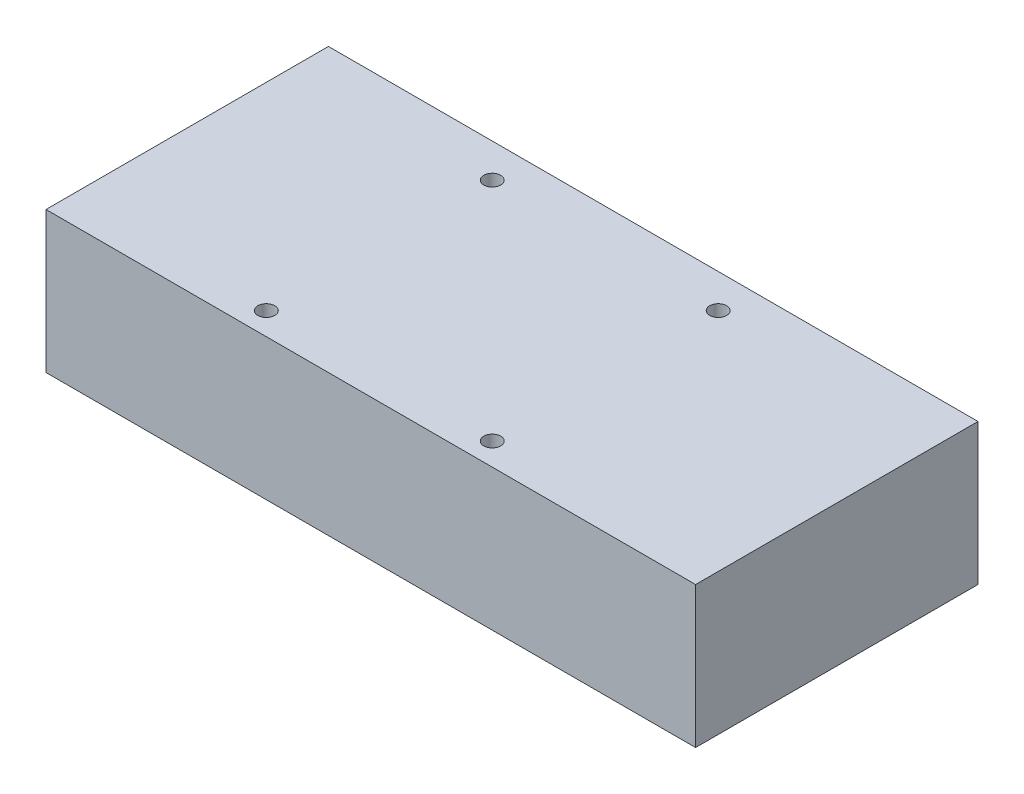
ISO-10303-21;
HEADER;
FILE_DESCRIPTION(('STEP AP214'),'2;1');
FILE_NAME('part.step','',(''),(''),'','','');
FILE_SCHEMA(('AUTOMOTIVE_DESIGN { 1 0 10303 214 1 1 1 1 }'));
ENDSEC;
DATA;
#1=APPLICATION_CONTEXT('core data for automotive mechanical design processes');
#2=APPLICATION_PROTOCOL_DEFINITION('international standard','automotive_design',2000,#1);
#3=PRODUCT_CONTEXT('',#1,'mechanical');
#4=PRODUCT('Part','Part','',(#3));
#5=PRODUCT_RELATED_PRODUCT_CATEGORY('part','',(#4));
#6=PRODUCT_DEFINITION_FORMATION('','',#4);
#7=PRODUCT_DEFINITION_CONTEXT('part definition',#1,'design');
#8=PRODUCT_DEFINITION('design','',#6,#7);
#9=PRODUCT_DEFINITION_SHAPE('','',#8);
#10=(LENGTH_UNIT() NAMED_UNIT(*) SI_UNIT(.MILLI.,.METRE.));
#11=(NAMED_UNIT(*) PLANE_ANGLE_UNIT() SI_UNIT($,.RADIAN.));
#12=(NAMED_UNIT(*) SI_UNIT($,.STERADIAN.) SOLID_ANGLE_UNIT());
#13=UNCERTAINTY_MEASURE_WITH_UNIT(LENGTH_MEASURE(1.E-05),#10,'distance_accuracy_value','');
#14=(GEOMETRIC_REPRESENTATION_CONTEXT(3) GLOBAL_UNCERTAINTY_ASSIGNED_CONTEXT((#13)) GLOBAL_UNIT_ASSIGNED_CONTEXT((#10,
#11,#12)) REPRESENTATION_CONTEXT('',''));
#15=CARTESIAN_POINT('',(0.,0.,0.));
#16=DIRECTION('',(0.,0.,1.));
#17=DIRECTION('',(1.,0.,0.));
#18=AXIS2_PLACEMENT_3D('',#15,#16,#17);
#19=CARTESIAN_POINT('',(0.,25.,0.));
#20=DIRECTION('',(0.,-1.,0.));
#21=DIRECTION('',(0.,0.,-1.));
#22=AXIS2_PLACEMENT_3D('',#19,#20,#21);
#23=PLANE('',#22);
#24=DIRECTION('',(0.,0.,-1.));
#25=VECTOR('',#24,1.);
#26=CARTESIAN_POINT('',(42.6353276353277,25.,-22.9344729344729));
#27=LINE('',#26,#25);
#28=CARTESIAN_POINT('',(42.6353276353277,25.,27.0655270655271));
#29=VERTEX_POINT('',#28);
#30=CARTESIAN_POINT('',(42.6353276353277,25.,-22.9344729344729));
#31=VERTEX_POINT('',#30);
#32=EDGE_CURVE('E96',#29,#31,#27,.T.);
#33=ORIENTED_EDGE('',*,*,#32,.T.);
#34=DIRECTION('',(-1.,0.,0.));
#35=VECTOR('',#34,1.);
#36=CARTESIAN_POINT('',(42.6353276353277,25.,-22.9344729344729));
#37=LINE('',#36,#35);
#38=CARTESIAN_POINT('',(-72.3646723646723,25.,-22.9344729344729));
#39=VERTEX_POINT('',#38);
#40=EDGE_CURVE('E91',#31,#39,#37,.T.);
#41=ORIENTED_EDGE('',*,*,#40,.T.);
#42=DIRECTION('',(0.,0.,1.));
#43=VECTOR('',#42,1.);
#44=CARTESIAN_POINT('',(-72.3646723646723,25.,-22.9344729344729));
#45=LINE('',#44,#43);
#46=CARTESIAN_POINT('',(-72.3646723646723,25.,27.0655270655271));
#47=VERTEX_POINT('',#46);
#48=EDGE_CURVE('E94',#39,#47,#45,.T.);
#49=ORIENTED_EDGE('',*,*,#48,.T.);
#50=DIRECTION('',(1.,0.,0.));
#51=VECTOR('',#50,1.);
#52=CARTESIAN_POINT('',(42.6353276353277,25.,27.0655270655271));
#53=LINE('',#52,#51);
#54=EDGE_CURVE('E61',#47,#29,#53,.T.);
#55=ORIENTED_EDGE('',*,*,#54,.T.);
#56=EDGE_LOOP('',(#33,#41,#49,#55));
#57=FACE_BOUND('',#56,.T.);
#58=CARTESIAN_POINT('',(-37.3646723646723,25.,-16.9344729344729));
#59=DIRECTION('',(0.,1.,0.));
#60=DIRECTION('',(0.,0.,1.));
#61=AXIS2_PLACEMENT_3D('',#58,#59,#60);
#62=CIRCLE('',#61,1.5);
#63=CARTESIAN_POINT('',(-37.3646723646723,25.,-15.4344729344729));
#64=VERTEX_POINT('',#63);
#65=EDGE_CURVE('E116',#64,#64,#62,.T.);
#66=ORIENTED_EDGE('',*,*,#65,.F.);
#67=EDGE_LOOP('',(#66));
#68=FACE_BOUND('',#67,.T.);
#69=CARTESIAN_POINT('',(2.63532763532767,25.,-16.9344729344729));
#70=DIRECTION('',(0.,1.,0.));
#71=DIRECTION('',(0.,0.,1.));
#72=AXIS2_PLACEMENT_3D('',#69,#70,#71);
#73=CIRCLE('',#72,1.5);
#74=CARTESIAN_POINT('',(2.63532763532767,25.,-15.4344729344729));
#75=VERTEX_POINT('',#74);
#76=EDGE_CURVE('E138',#75,#75,#73,.T.);
#77=ORIENTED_EDGE('',*,*,#76,.F.);
#78=EDGE_LOOP('',(#77));
#79=FACE_BOUND('',#78,.T.);
#80=CARTESIAN_POINT('',(2.63532763532767,25.,23.0655270655271));
#81=DIRECTION('',(0.,1.,0.));
#82=DIRECTION('',(0.,0.,1.));
#83=AXIS2_PLACEMENT_3D('',#80,#81,#82);
#84=CIRCLE('',#83,1.5);
#85=CARTESIAN_POINT('',(2.63532763532767,25.,24.5655270655271));
#86=VERTEX_POINT('',#85);
#87=EDGE_CURVE('E146',#86,#86,#84,.T.);
#88=ORIENTED_EDGE('',*,*,#87,.F.);
#89=EDGE_LOOP('',(#88));
#90=FACE_BOUND('',#89,.T.);
#91=CARTESIAN_POINT('',(-37.3646723646723,25.,23.0655270655271));
#92=DIRECTION('',(0.,1.,0.));
#93=DIRECTION('',(0.,0.,1.));
#94=AXIS2_PLACEMENT_3D('',#91,#92,#93);
#95=CIRCLE('',#94,1.5);
#96=CARTESIAN_POINT('',(-37.3646723646723,25.,24.5655270655271));
#97=VERTEX_POINT('',#96);
#98=EDGE_CURVE('E154',#97,#97,#95,.T.);
#99=ORIENTED_EDGE('',*,*,#98,.F.);
#100=EDGE_LOOP('',(#99));
#101=FACE_BOUND('',#100,.T.);
#102=ADVANCED_FACE('F43',(#57,#68,#79,#90,#101),#23,.F.);
#103=CARTESIAN_POINT('',(0.,0.,0.));
#104=DIRECTION('',(0.,-1.,0.));
#105=DIRECTION('',(0.,0.,-1.));
#106=AXIS2_PLACEMENT_3D('',#103,#104,#105);
#107=PLANE('',#106);
#108=CARTESIAN_POINT('',(2.63532763532767,0.,23.0655270655271));
#109=DIRECTION('',(0.,1.,0.));
#110=DIRECTION('',(0.,0.,1.));
#111=AXIS2_PLACEMENT_3D('',#108,#109,#110);
#112=CIRCLE('',#111,1.5);
#113=CARTESIAN_POINT('',(2.63532763532767,0.,24.5655270655271));
#114=VERTEX_POINT('',#113);
#115=EDGE_CURVE('E150',#114,#114,#112,.T.);
#116=ORIENTED_EDGE('',*,*,#115,.T.);
#117=EDGE_LOOP('',(#116));
#118=FACE_BOUND('',#117,.T.);
#119=CARTESIAN_POINT('',(-37.3646723646723,0.,-16.9344729344729));
#120=DIRECTION('',(0.,1.,0.));
#121=DIRECTION('',(0.,0.,1.));
#122=AXIS2_PLACEMENT_3D('',#119,#120,#121);
#123=CIRCLE('',#122,1.5);
#124=CARTESIAN_POINT('',(-37.3646723646723,0.,-15.4344729344729));
#125=VERTEX_POINT('',#124);
#126=EDGE_CURVE('E134',#125,#125,#123,.T.);
#127=ORIENTED_EDGE('',*,*,#126,.T.);
#128=EDGE_LOOP('',(#127));
#129=FACE_BOUND('',#128,.T.);
#130=DIRECTION('',(0.,0.,-1.));
#131=VECTOR('',#130,1.);
#132=CARTESIAN_POINT('',(42.6353276353277,0.,-22.9344729344729));
#133=LINE('',#132,#131);
#134=CARTESIAN_POINT('',(42.6353276353277,0.,27.0655270655271));
#135=VERTEX_POINT('',#134);
#136=CARTESIAN_POINT('',(42.6353276353277,0.,-22.9344729344729));
#137=VERTEX_POINT('',#136);
#138=EDGE_CURVE('E112',#135,#137,#133,.T.);
#139=ORIENTED_EDGE('',*,*,#138,.F.);
#140=DIRECTION('',(1.,0.,0.));
#141=VECTOR('',#140,1.);
#142=CARTESIAN_POINT('',(42.6353276353277,0.,27.0655270655271));
#143=LINE('',#142,#141);
#144=CARTESIAN_POINT('',(-72.3646723646723,0.,27.0655270655271));
#145=VERTEX_POINT('',#144);
#146=EDGE_CURVE('E84',#145,#135,#143,.T.);
#147=ORIENTED_EDGE('',*,*,#146,.F.);
#148=DIRECTION('',(0.,0.,1.));
#149=VECTOR('',#148,1.);
#150=CARTESIAN_POINT('',(-72.3646723646723,0.,-22.9344729344729));
#151=LINE('',#150,#149);
#152=CARTESIAN_POINT('',(-72.3646723646723,0.,-22.9344729344729));
#153=VERTEX_POINT('',#152);
#154=EDGE_CURVE('E78',#153,#145,#151,.T.);
#155=ORIENTED_EDGE('',*,*,#154,.F.);
#156=DIRECTION('',(-1.,0.,0.));
#157=VECTOR('',#156,1.);
#158=CARTESIAN_POINT('',(42.6353276353277,0.,-22.9344729344729));
#159=LINE('',#158,#157);
#160=EDGE_CURVE('E101',#137,#153,#159,.T.);
#161=ORIENTED_EDGE('',*,*,#160,.F.);
#162=EDGE_LOOP('',(#139,#147,#155,#161));
#163=FACE_BOUND('',#162,.T.);
#164=CARTESIAN_POINT('',(2.63532763532767,0.,-16.9344729344729));
#165=DIRECTION('',(0.,1.,0.));
#166=DIRECTION('',(0.,0.,1.));
#167=AXIS2_PLACEMENT_3D('',#164,#165,#166);
#168=CIRCLE('',#167,1.5);
#169=CARTESIAN_POINT('',(2.63532763532767,0.,-15.4344729344729));
#170=VERTEX_POINT('',#169);
#171=EDGE_CURVE('E142',#170,#170,#168,.T.);
#172=ORIENTED_EDGE('',*,*,#171,.T.);
#173=EDGE_LOOP('',(#172));
#174=FACE_BOUND('',#173,.T.);
#175=CARTESIAN_POINT('',(-37.3646723646723,0.,23.0655270655271));
#176=DIRECTION('',(0.,1.,0.));
#177=DIRECTION('',(0.,0.,1.));
#178=AXIS2_PLACEMENT_3D('',#175,#176,#177);
#179=CIRCLE('',#178,1.5);
#180=CARTESIAN_POINT('',(-37.3646723646723,0.,24.5655270655271));
#181=VERTEX_POINT('',#180);
#182=EDGE_CURVE('E158',#181,#181,#179,.T.);
#183=ORIENTED_EDGE('',*,*,#182,.T.);
#184=EDGE_LOOP('',(#183));
#185=FACE_BOUND('',#184,.T.);
#186=ADVANCED_FACE('F129',(#118,#129,#163,#174,#185),#107,.T.);
#187=CARTESIAN_POINT('',(42.6353276353277,25.,-22.9344729344729));
#188=DIRECTION('',(-1.,0.,0.));
#189=DIRECTION('',(0.,0.,1.));
#190=AXIS2_PLACEMENT_3D('',#187,#188,#189);
#191=PLANE('',#190);
#192=ORIENTED_EDGE('',*,*,#138,.T.);
#193=DIRECTION('',(0.,-1.,0.));
#194=VECTOR('',#193,1.);
#195=CARTESIAN_POINT('',(42.6353276353277,25.,-22.9344729344729));
#196=LINE('',#195,#194);
#197=EDGE_CURVE('E11',#31,#137,#196,.T.);
#198=ORIENTED_EDGE('',*,*,#197,.F.);
#199=ORIENTED_EDGE('',*,*,#32,.F.);
#200=DIRECTION('',(0.,-1.,0.));
#201=VECTOR('',#200,1.);
#202=CARTESIAN_POINT('',(42.6353276353277,25.,27.0655270655271));
#203=LINE('',#202,#201);
#204=EDGE_CURVE('E108',#29,#135,#203,.T.);
#205=ORIENTED_EDGE('',*,*,#204,.T.);
#206=EDGE_LOOP('',(#192,#198,#199,#205));
#207=FACE_BOUND('',#206,.T.);
#208=ADVANCED_FACE('F45',(#207),#191,.F.);
#209=CARTESIAN_POINT('',(42.6353276353277,25.,-22.9344729344729));
#210=DIRECTION('',(0.,0.,1.));
#211=DIRECTION('',(1.,0.,0.));
#212=AXIS2_PLACEMENT_3D('',#209,#210,#211);
#213=PLANE('',#212);
#214=ORIENTED_EDGE('',*,*,#160,.T.);
#215=DIRECTION('',(0.,-1.,0.));
#216=VECTOR('',#215,1.);
#217=CARTESIAN_POINT('',(-72.3646723646723,25.,-22.9344729344729));
#218=LINE('',#217,#216);
#219=EDGE_CURVE('E53',#39,#153,#218,.T.);
#220=ORIENTED_EDGE('',*,*,#219,.F.);
#221=ORIENTED_EDGE('',*,*,#40,.F.);
#222=ORIENTED_EDGE('',*,*,#197,.T.);
#223=EDGE_LOOP('',(#214,#220,#221,#222));
#224=FACE_BOUND('',#223,.T.);
#225=ADVANCED_FACE('F100',(#224),#213,.F.);
#226=CARTESIAN_POINT('',(-72.3646723646723,25.,-22.9344729344729));
#227=DIRECTION('',(1.,0.,0.));
#228=DIRECTION('',(0.,0.,-1.));
#229=AXIS2_PLACEMENT_3D('',#226,#227,#228);
#230=PLANE('',#229);
#231=ORIENTED_EDGE('',*,*,#154,.T.);
#232=DIRECTION('',(0.,-1.,0.));
#233=VECTOR('',#232,1.);
#234=CARTESIAN_POINT('',(-72.3646723646723,25.,27.0655270655271));
#235=LINE('',#234,#233);
#236=EDGE_CURVE('E103',#47,#145,#235,.T.);
#237=ORIENTED_EDGE('',*,*,#236,.F.);
#238=ORIENTED_EDGE('',*,*,#48,.F.);
#239=ORIENTED_EDGE('',*,*,#219,.T.);
#240=EDGE_LOOP('',(#231,#237,#238,#239));
#241=FACE_BOUND('',#240,.T.);
#242=ADVANCED_FACE('F104',(#241),#230,.F.);
#243=CARTESIAN_POINT('',(42.6353276353277,25.,27.0655270655271));
#244=DIRECTION('',(0.,0.,-1.));
#245=DIRECTION('',(-1.,0.,0.));
#246=AXIS2_PLACEMENT_3D('',#243,#244,#245);
#247=PLANE('',#246);
#248=ORIENTED_EDGE('',*,*,#146,.T.);
#249=ORIENTED_EDGE('',*,*,#204,.F.);
#250=ORIENTED_EDGE('',*,*,#54,.F.);
#251=ORIENTED_EDGE('',*,*,#236,.T.);
#252=EDGE_LOOP('',(#248,#249,#250,#251));
#253=FACE_BOUND('',#252,.T.);
#254=ADVANCED_FACE('F126',(#253),#247,.F.);
#255=CARTESIAN_POINT('',(-37.3646723646723,25.,-16.9344729344729));
#256=DIRECTION('',(0.,-1.,0.));
#257=DIRECTION('',(0.,0.,-1.));
#258=AXIS2_PLACEMENT_3D('',#255,#256,#257);
#259=CYLINDRICAL_SURFACE('',#258,1.5);
#260=ORIENTED_EDGE('',*,*,#65,.T.);
#261=EDGE_LOOP('',(#260));
#262=FACE_BOUND('',#261,.T.);
#263=ORIENTED_EDGE('',*,*,#126,.F.);
#264=EDGE_LOOP('',(#263));
#265=FACE_BOUND('',#264,.T.);
#266=ADVANCED_FACE('F177',(#262,#265),#259,.F.);
#267=CARTESIAN_POINT('',(2.63532763532767,25.,-16.9344729344729));
#268=DIRECTION('',(0.,-1.,0.));
#269=DIRECTION('',(0.,0.,-1.));
#270=AXIS2_PLACEMENT_3D('',#267,#268,#269);
#271=CYLINDRICAL_SURFACE('',#270,1.5);
#272=ORIENTED_EDGE('',*,*,#76,.T.);
#273=EDGE_LOOP('',(#272));
#274=FACE_BOUND('',#273,.T.);
#275=ORIENTED_EDGE('',*,*,#171,.F.);
#276=EDGE_LOOP('',(#275));
#277=FACE_BOUND('',#276,.T.);
#278=ADVANCED_FACE('F231',(#274,#277),#271,.F.);
#279=CARTESIAN_POINT('',(2.63532763532767,25.,23.0655270655271));
#280=DIRECTION('',(0.,-1.,0.));
#281=DIRECTION('',(0.,0.,-1.));
#282=AXIS2_PLACEMENT_3D('',#279,#280,#281);
#283=CYLINDRICAL_SURFACE('',#282,1.5);
#284=ORIENTED_EDGE('',*,*,#87,.T.);
#285=EDGE_LOOP('',(#284));
#286=FACE_BOUND('',#285,.T.);
#287=ORIENTED_EDGE('',*,*,#115,.F.);
#288=EDGE_LOOP('',(#287));
#289=FACE_BOUND('',#288,.T.);
#290=ADVANCED_FACE('F240',(#286,#289),#283,.F.);
#291=CARTESIAN_POINT('',(-37.3646723646723,25.,23.0655270655271));
#292=DIRECTION('',(0.,-1.,0.));
#293=DIRECTION('',(0.,0.,-1.));
#294=AXIS2_PLACEMENT_3D('',#291,#292,#293);
#295=CYLINDRICAL_SURFACE('',#294,1.5);
#296=ORIENTED_EDGE('',*,*,#98,.T.);
#297=EDGE_LOOP('',(#296));
#298=FACE_BOUND('',#297,.T.);
#299=ORIENTED_EDGE('',*,*,#182,.F.);
#300=EDGE_LOOP('',(#299));
#301=FACE_BOUND('',#300,.T.);
#302=ADVANCED_FACE('F166',(#298,#301),#295,.F.);
#303=CLOSED_SHELL('',(#102,#186,#208,#225,#242,#254,#266,#278,#290,#302));
#304=MANIFOLD_SOLID_BREP('B2',#303);
#305=ADVANCED_BREP_SHAPE_REPRESENTATION('',(#18,#304),#14);
#306=SHAPE_DEFINITION_REPRESENTATION(#9,#305);
ENDSEC;
END-ISO-10303-21;
